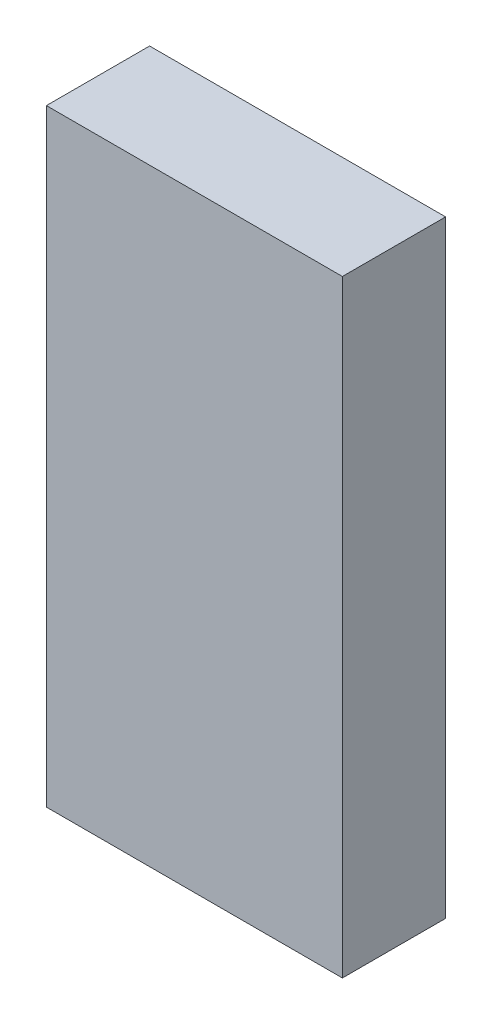
ISO-10303-21;
HEADER;
FILE_DESCRIPTION(('STEP AP214'),'2;1');
FILE_NAME('part.step','',(''),(''),'','','');
FILE_SCHEMA(('AUTOMOTIVE_DESIGN { 1 0 10303 214 1 1 1 1 }'));
ENDSEC;
DATA;
#1=APPLICATION_CONTEXT('core data for automotive mechanical design processes');
#2=APPLICATION_PROTOCOL_DEFINITION('international standard','automotive_design',2000,#1);
#3=PRODUCT_CONTEXT('',#1,'mechanical');
#4=PRODUCT('Part','Part','',(#3));
#5=PRODUCT_RELATED_PRODUCT_CATEGORY('part','',(#4));
#6=PRODUCT_DEFINITION_FORMATION('','',#4);
#7=PRODUCT_DEFINITION_CONTEXT('part definition',#1,'design');
#8=PRODUCT_DEFINITION('design','',#6,#7);
#9=PRODUCT_DEFINITION_SHAPE('','',#8);
#10=(LENGTH_UNIT() NAMED_UNIT(*) SI_UNIT(.MILLI.,.METRE.));
#11=(NAMED_UNIT(*) PLANE_ANGLE_UNIT() SI_UNIT($,.RADIAN.));
#12=(NAMED_UNIT(*) SI_UNIT($,.STERADIAN.) SOLID_ANGLE_UNIT());
#13=UNCERTAINTY_MEASURE_WITH_UNIT(LENGTH_MEASURE(1.E-05),#10,'distance_accuracy_value','');
#14=(GEOMETRIC_REPRESENTATION_CONTEXT(3) GLOBAL_UNCERTAINTY_ASSIGNED_CONTEXT((#13)) GLOBAL_UNIT_ASSIGNED_CONTEXT((#10,
#11,#12)) REPRESENTATION_CONTEXT('',''));
#15=CARTESIAN_POINT('',(0.,0.,0.));
#16=DIRECTION('',(0.,0.,1.));
#17=DIRECTION('',(1.,0.,0.));
#18=AXIS2_PLACEMENT_3D('',#15,#16,#17);
#19=CARTESIAN_POINT('',(-3.80000002,-7.79999964,2.64999978));
#20=DIRECTION('',(0.,0.,-1.));
#21=DIRECTION('',(-1.,0.,0.));
#22=AXIS2_PLACEMENT_3D('',#19,#20,#21);
#23=PLANE('',#22);
#24=DIRECTION('',(0.,1.,0.));
#25=VECTOR('',#24,1.);
#26=CARTESIAN_POINT('',(3.80000002,-7.79999964,2.64999978));
#27=LINE('',#26,#25);
#28=CARTESIAN_POINT('',(3.80000002,-7.79999964,2.64999978));
#29=VERTEX_POINT('',#28);
#30=CARTESIAN_POINT('',(3.80000002,7.79999964,2.64999978));
#31=VERTEX_POINT('',#30);
#32=EDGE_CURVE('E55',#29,#31,#27,.T.);
#33=ORIENTED_EDGE('',*,*,#32,.T.);
#34=DIRECTION('',(1.,0.,0.));
#35=VECTOR('',#34,1.);
#36=CARTESIAN_POINT('',(3.80000002,7.79999964,2.64999978));
#37=LINE('',#36,#35);
#38=CARTESIAN_POINT('',(-3.80000002,7.79999964,2.64999978));
#39=VERTEX_POINT('',#38);
#40=EDGE_CURVE('E57',#31,#39,#37,.F.);
#41=ORIENTED_EDGE('',*,*,#40,.T.);
#42=DIRECTION('',(0.,1.,0.));
#43=VECTOR('',#42,1.);
#44=CARTESIAN_POINT('',(-3.80000002,7.79999964,2.64999978));
#45=LINE('',#44,#43);
#46=CARTESIAN_POINT('',(-3.80000002,-7.79999964,2.64999978));
#47=VERTEX_POINT('',#46);
#48=EDGE_CURVE('E20',#39,#47,#45,.F.);
#49=ORIENTED_EDGE('',*,*,#48,.T.);
#50=DIRECTION('',(1.,0.,0.));
#51=VECTOR('',#50,1.);
#52=CARTESIAN_POINT('',(-3.80000002,-7.79999964,2.64999978));
#53=LINE('',#52,#51);
#54=EDGE_CURVE('E80',#47,#29,#53,.T.);
#55=ORIENTED_EDGE('',*,*,#54,.T.);
#56=EDGE_LOOP('',(#33,#41,#49,#55));
#57=FACE_BOUND('',#56,.T.);
#58=ADVANCED_FACE('F17',(#57),#23,.F.);
#59=CARTESIAN_POINT('',(-3.80000002,7.79999964,0.));
#60=DIRECTION('',(1.,0.,0.));
#61=DIRECTION('',(0.,0.,-1.));
#62=AXIS2_PLACEMENT_3D('',#59,#60,#61);
#63=PLANE('',#62);
#64=DIRECTION('',(0.,0.,1.));
#65=VECTOR('',#64,1.);
#66=CARTESIAN_POINT('',(-3.80000002,-7.79999964,0.));
#67=LINE('',#66,#65);
#68=CARTESIAN_POINT('',(-3.80000002,-7.79999964,0.));
#69=VERTEX_POINT('',#68);
#70=EDGE_CURVE('E68',#69,#47,#67,.T.);
#71=ORIENTED_EDGE('',*,*,#70,.T.);
#72=ORIENTED_EDGE('',*,*,#48,.F.);
#73=DIRECTION('',(0.,0.,-1.));
#74=VECTOR('',#73,1.);
#75=CARTESIAN_POINT('',(-3.80000002,7.79999964,0.));
#76=LINE('',#75,#74);
#77=CARTESIAN_POINT('',(-3.80000002,7.79999964,0.));
#78=VERTEX_POINT('',#77);
#79=EDGE_CURVE('E63',#39,#78,#76,.T.);
#80=ORIENTED_EDGE('',*,*,#79,.T.);
#81=DIRECTION('',(0.,1.,0.));
#82=VECTOR('',#81,1.);
#83=CARTESIAN_POINT('',(-3.80000002,-7.79999964,0.));
#84=LINE('',#83,#82);
#85=EDGE_CURVE('E83',#69,#78,#84,.T.);
#86=ORIENTED_EDGE('',*,*,#85,.F.);
#87=EDGE_LOOP('',(#71,#72,#80,#86));
#88=FACE_BOUND('',#87,.T.);
#89=ADVANCED_FACE('F65',(#88),#63,.F.);
#90=CARTESIAN_POINT('',(3.80000002,7.79999964,0.));
#91=DIRECTION('',(0.,-1.,0.));
#92=DIRECTION('',(0.,0.,-1.));
#93=AXIS2_PLACEMENT_3D('',#90,#91,#92);
#94=PLANE('',#93);
#95=ORIENTED_EDGE('',*,*,#79,.F.);
#96=ORIENTED_EDGE('',*,*,#40,.F.);
#97=DIRECTION('',(0.,0.,1.));
#98=VECTOR('',#97,1.);
#99=CARTESIAN_POINT('',(3.80000002,7.79999964,0.));
#100=LINE('',#99,#98);
#101=CARTESIAN_POINT('',(3.80000002,7.79999964,0.));
#102=VERTEX_POINT('',#101);
#103=EDGE_CURVE('E75',#31,#102,#100,.F.);
#104=ORIENTED_EDGE('',*,*,#103,.T.);
#105=DIRECTION('',(-1.,0.,0.));
#106=VECTOR('',#105,1.);
#107=CARTESIAN_POINT('',(-3.80000002,7.79999964,0.));
#108=LINE('',#107,#106);
#109=EDGE_CURVE('E72',#78,#102,#108,.F.);
#110=ORIENTED_EDGE('',*,*,#109,.F.);
#111=EDGE_LOOP('',(#95,#96,#104,#110));
#112=FACE_BOUND('',#111,.T.);
#113=ADVANCED_FACE('F70',(#112),#94,.F.);
#114=CARTESIAN_POINT('',(3.80000002,-7.79999964,0.));
#115=DIRECTION('',(-1.,0.,0.));
#116=DIRECTION('',(0.,0.,1.));
#117=AXIS2_PLACEMENT_3D('',#114,#115,#116);
#118=PLANE('',#117);
#119=ORIENTED_EDGE('',*,*,#103,.F.);
#120=ORIENTED_EDGE('',*,*,#32,.F.);
#121=DIRECTION('',(0.,0.,1.));
#122=VECTOR('',#121,1.);
#123=CARTESIAN_POINT('',(3.80000002,-7.79999964,0.));
#124=LINE('',#123,#122);
#125=CARTESIAN_POINT('',(3.80000002,-7.79999964,0.));
#126=VERTEX_POINT('',#125);
#127=EDGE_CURVE('E35',#29,#126,#124,.F.);
#128=ORIENTED_EDGE('',*,*,#127,.T.);
#129=DIRECTION('',(0.,1.,0.));
#130=VECTOR('',#129,1.);
#131=CARTESIAN_POINT('',(3.80000002,-7.79999964,0.));
#132=LINE('',#131,#130);
#133=EDGE_CURVE('E26',#102,#126,#132,.F.);
#134=ORIENTED_EDGE('',*,*,#133,.F.);
#135=EDGE_LOOP('',(#119,#120,#128,#134));
#136=FACE_BOUND('',#135,.T.);
#137=ADVANCED_FACE('F89',(#136),#118,.F.);
#138=CARTESIAN_POINT('',(-3.80000002,-7.79999964,0.));
#139=DIRECTION('',(0.,1.,0.));
#140=DIRECTION('',(0.,0.,1.));
#141=AXIS2_PLACEMENT_3D('',#138,#139,#140);
#142=PLANE('',#141);
#143=ORIENTED_EDGE('',*,*,#127,.F.);
#144=ORIENTED_EDGE('',*,*,#54,.F.);
#145=ORIENTED_EDGE('',*,*,#70,.F.);
#146=DIRECTION('',(-1.,0.,0.));
#147=VECTOR('',#146,1.);
#148=CARTESIAN_POINT('',(-3.80000002,-7.79999964,0.));
#149=LINE('',#148,#147);
#150=EDGE_CURVE('E11',#126,#69,#149,.T.);
#151=ORIENTED_EDGE('',*,*,#150,.F.);
#152=EDGE_LOOP('',(#143,#144,#145,#151));
#153=FACE_BOUND('',#152,.T.);
#154=ADVANCED_FACE('F91',(#153),#142,.F.);
#155=CARTESIAN_POINT('',(-3.80000002,-7.79999964,0.));
#156=DIRECTION('',(0.,0.,-1.));
#157=DIRECTION('',(-1.,0.,0.));
#158=AXIS2_PLACEMENT_3D('',#155,#156,#157);
#159=PLANE('',#158);
#160=ORIENTED_EDGE('',*,*,#133,.T.);
#161=ORIENTED_EDGE('',*,*,#150,.T.);
#162=ORIENTED_EDGE('',*,*,#85,.T.);
#163=ORIENTED_EDGE('',*,*,#109,.T.);
#164=EDGE_LOOP('',(#160,#161,#162,#163));
#165=FACE_BOUND('',#164,.T.);
#166=ADVANCED_FACE('F88',(#165),#159,.T.);
#167=CLOSED_SHELL('',(#58,#89,#113,#137,#154,#166));
#168=MANIFOLD_SOLID_BREP('B1',#167);
#169=ADVANCED_BREP_SHAPE_REPRESENTATION('',(#18,#168),#14);
#170=SHAPE_DEFINITION_REPRESENTATION(#9,#169);
ENDSEC;
END-ISO-10303-21;
